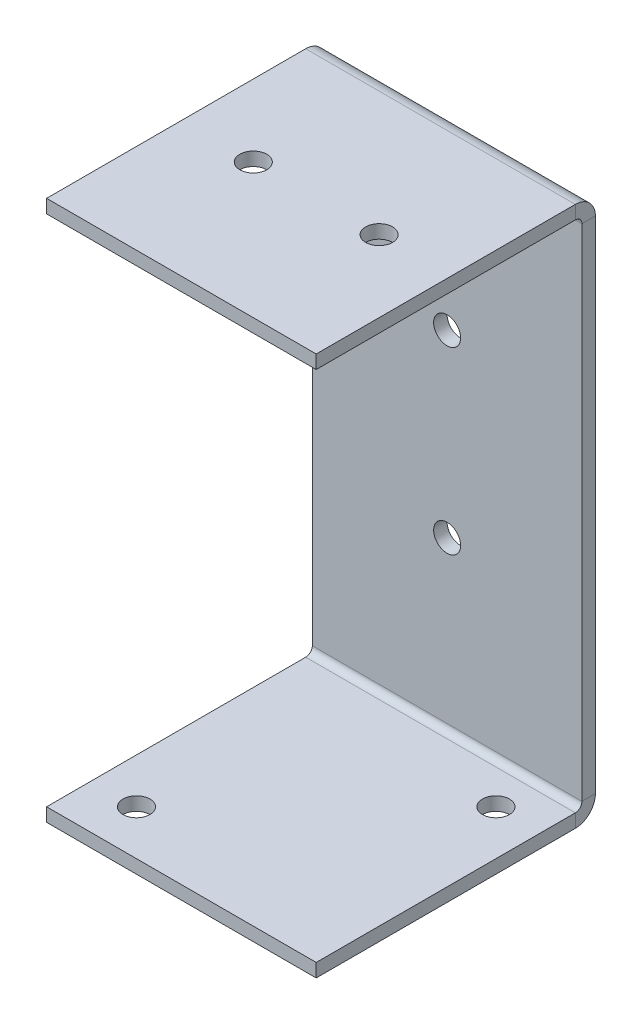
ISO-10303-21;
HEADER;
FILE_DESCRIPTION(('STEP AP214'),'2;1');
FILE_NAME('part.step','',(''),(''),'','','');
FILE_SCHEMA(('AUTOMOTIVE_DESIGN { 1 0 10303 214 1 1 1 1 }'));
ENDSEC;
DATA;
#1=APPLICATION_CONTEXT('core data for automotive mechanical design processes');
#2=APPLICATION_PROTOCOL_DEFINITION('international standard','automotive_design',2000,#1);
#3=PRODUCT_CONTEXT('',#1,'mechanical');
#4=PRODUCT('Part','Part','',(#3));
#5=PRODUCT_RELATED_PRODUCT_CATEGORY('part','',(#4));
#6=PRODUCT_DEFINITION_FORMATION('','',#4);
#7=PRODUCT_DEFINITION_CONTEXT('part definition',#1,'design');
#8=PRODUCT_DEFINITION('design','',#6,#7);
#9=PRODUCT_DEFINITION_SHAPE('','',#8);
#10=(LENGTH_UNIT() NAMED_UNIT(*) SI_UNIT(.MILLI.,.METRE.));
#11=(NAMED_UNIT(*) PLANE_ANGLE_UNIT() SI_UNIT($,.RADIAN.));
#12=(NAMED_UNIT(*) SI_UNIT($,.STERADIAN.) SOLID_ANGLE_UNIT());
#13=UNCERTAINTY_MEASURE_WITH_UNIT(LENGTH_MEASURE(1.E-05),#10,'distance_accuracy_value','');
#14=(GEOMETRIC_REPRESENTATION_CONTEXT(3) GLOBAL_UNCERTAINTY_ASSIGNED_CONTEXT((#13)) GLOBAL_UNIT_ASSIGNED_CONTEXT((#10,
#11,#12)) REPRESENTATION_CONTEXT('',''));
#15=CARTESIAN_POINT('',(0.,0.,0.));
#16=DIRECTION('',(0.,0.,1.));
#17=DIRECTION('',(1.,0.,0.));
#18=AXIS2_PLACEMENT_3D('',#15,#16,#17);
#19=CARTESIAN_POINT('',(0.,-30.4309729097066,-29.5690270902934));
#20=DIRECTION('',(0.,0.,-1.));
#21=DIRECTION('',(0.,1.,0.));
#22=AXIS2_PLACEMENT_3D('',#19,#20,#21);
#23=PLANE('',#22);
#24=CARTESIAN_POINT('',(15.,38.6380541805867,-29.5690270902932));
#25=DIRECTION('',(0.,0.,-1.));
#26=DIRECTION('',(0.,1.,0.));
#27=AXIS2_PLACEMENT_3D('',#24,#25,#26);
#28=CIRCLE('',#27,1.49999999999999);
#29=CARTESIAN_POINT('',(15.,40.1380541805867,-29.5690270902932));
#30=VERTEX_POINT('',#29);
#31=EDGE_CURVE('E655',#30,#30,#28,.T.);
#32=ORIENTED_EDGE('',*,*,#31,.T.);
#33=EDGE_LOOP('',(#32));
#34=FACE_BOUND('',#33,.T.);
#35=CARTESIAN_POINT('',(15.,18.6380541805867,-29.5690270902933));
#36=DIRECTION('',(0.,0.,-1.));
#37=DIRECTION('',(0.,1.,0.));
#38=AXIS2_PLACEMENT_3D('',#35,#36,#37);
#39=CIRCLE('',#38,1.49999999999999);
#40=CARTESIAN_POINT('',(15.,20.1380541805867,-29.5690270902933));
#41=VERTEX_POINT('',#40);
#42=EDGE_CURVE('E317',#41,#41,#39,.T.);
#43=ORIENTED_EDGE('',*,*,#42,.T.);
#44=EDGE_LOOP('',(#43));
#45=FACE_BOUND('',#44,.T.);
#46=DIRECTION('',(0.,-1.,0.));
#47=VECTOR('',#46,1.);
#48=CARTESIAN_POINT('',(0.,-30.4309729097066,-29.5690270902934));
#49=LINE('',#48,#47);
#50=CARTESIAN_POINT('',(0.,56.4014541805867,-29.5690270902932));
#51=VERTEX_POINT('',#50);
#52=CARTESIAN_POINT('',(0.,0.7366,-29.5690270902933));
#53=VERTEX_POINT('',#52);
#54=EDGE_CURVE('E74',#51,#53,#49,.T.);
#55=ORIENTED_EDGE('',*,*,#54,.T.);
#56=DIRECTION('',(1.,0.,0.));
#57=VECTOR('',#56,1.);
#58=CARTESIAN_POINT('',(0.,0.736600000000007,-29.5690270902933));
#59=LINE('',#58,#57);
#60=CARTESIAN_POINT('',(30.,0.7366,-29.5690270902933));
#61=VERTEX_POINT('',#60);
#62=EDGE_CURVE('E66',#53,#61,#59,.T.);
#63=ORIENTED_EDGE('',*,*,#62,.T.);
#64=DIRECTION('',(0.,1.,0.));
#65=VECTOR('',#64,1.);
#66=CARTESIAN_POINT('',(30.,-30.4309729097066,-29.5690270902934));
#67=LINE('',#66,#65);
#68=CARTESIAN_POINT('',(30.,56.4014541805867,-29.5690270902932));
#69=VERTEX_POINT('',#68);
#70=EDGE_CURVE('E82',#61,#69,#67,.T.);
#71=ORIENTED_EDGE('',*,*,#70,.T.);
#72=DIRECTION('',(1.,0.,0.));
#73=VECTOR('',#72,1.);
#74=CARTESIAN_POINT('',(0.,56.4014541805867,-29.5690270902932));
#75=LINE('',#74,#73);
#76=EDGE_CURVE('E267',#51,#69,#75,.T.);
#77=ORIENTED_EDGE('',*,*,#76,.F.);
#78=EDGE_LOOP('',(#55,#63,#71,#77));
#79=FACE_BOUND('',#78,.T.);
#80=ADVANCED_FACE('F57',(#34,#45,#79),#23,.F.);
#81=CARTESIAN_POINT('',(0.,-30.4309729097066,-31.0690270902935));
#82=DIRECTION('',(-1.,0.,0.));
#83=DIRECTION('',(0.,-1.,0.));
#84=AXIS2_PLACEMENT_3D('',#81,#82,#83);
#85=PLANE('',#84);
#86=DIRECTION('',(0.,0.,-1.));
#87=VECTOR('',#86,1.);
#88=CARTESIAN_POINT('',(0.,0.736600000000014,-31.0690270902933));
#89=LINE('',#88,#87);
#90=CARTESIAN_POINT('',(0.,0.736600000000007,-31.0690270902933));
#91=VERTEX_POINT('',#90);
#92=EDGE_CURVE('E14',#53,#91,#89,.T.);
#93=ORIENTED_EDGE('',*,*,#92,.F.);
#94=ORIENTED_EDGE('',*,*,#54,.F.);
#95=DIRECTION('',(0.,0.,-1.));
#96=VECTOR('',#95,1.);
#97=CARTESIAN_POINT('',(0.,56.4014541805867,-31.0690270902932));
#98=LINE('',#97,#96);
#99=CARTESIAN_POINT('',(0.,56.4014541805867,-31.0690270902931));
#100=VERTEX_POINT('',#99);
#101=EDGE_CURVE('E264',#51,#100,#98,.T.);
#102=ORIENTED_EDGE('',*,*,#101,.T.);
#103=DIRECTION('',(0.,-1.,0.));
#104=VECTOR('',#103,1.);
#105=CARTESIAN_POINT('',(0.,-30.4309729097066,-31.0690270902935));
#106=LINE('',#105,#104);
#107=EDGE_CURVE('E276',#100,#91,#106,.T.);
#108=ORIENTED_EDGE('',*,*,#107,.T.);
#109=EDGE_LOOP('',(#93,#94,#102,#108));
#110=FACE_BOUND('',#109,.T.);
#111=ADVANCED_FACE('F59',(#110),#85,.T.);
#112=CARTESIAN_POINT('',(30.,-30.4309729097066,-31.0690270902935));
#113=DIRECTION('',(1.,0.,0.));
#114=DIRECTION('',(0.,1.,0.));
#115=AXIS2_PLACEMENT_3D('',#112,#113,#114);
#116=PLANE('',#115);
#117=DIRECTION('',(0.,0.,1.));
#118=VECTOR('',#117,1.);
#119=CARTESIAN_POINT('',(30.,0.736600000000014,-31.0690270902933));
#120=LINE('',#119,#118);
#121=CARTESIAN_POINT('',(30.,0.736600000000007,-31.0690270902933));
#122=VERTEX_POINT('',#121);
#123=EDGE_CURVE('E273',#122,#61,#120,.T.);
#124=ORIENTED_EDGE('',*,*,#123,.F.);
#125=DIRECTION('',(0.,1.,0.));
#126=VECTOR('',#125,1.);
#127=CARTESIAN_POINT('',(30.,-30.4309729097066,-31.0690270902935));
#128=LINE('',#127,#126);
#129=CARTESIAN_POINT('',(30.,56.4014541805867,-31.0690270902931));
#130=VERTEX_POINT('',#129);
#131=EDGE_CURVE('E61',#122,#130,#128,.T.);
#132=ORIENTED_EDGE('',*,*,#131,.T.);
#133=DIRECTION('',(0.,0.,1.));
#134=VECTOR('',#133,1.);
#135=CARTESIAN_POINT('',(30.,56.4014541805867,-31.0690270902932));
#136=LINE('',#135,#134);
#137=EDGE_CURVE('E270',#130,#69,#136,.T.);
#138=ORIENTED_EDGE('',*,*,#137,.T.);
#139=ORIENTED_EDGE('',*,*,#70,.F.);
#140=EDGE_LOOP('',(#124,#132,#138,#139));
#141=FACE_BOUND('',#140,.T.);
#142=ADVANCED_FACE('F281',(#141),#116,.T.);
#143=CARTESIAN_POINT('',(0.,-30.4309729097066,-31.0690270902935));
#144=DIRECTION('',(0.,0.,-1.));
#145=DIRECTION('',(0.,1.,0.));
#146=AXIS2_PLACEMENT_3D('',#143,#144,#145);
#147=PLANE('',#146);
#148=CARTESIAN_POINT('',(15.,38.6380541805867,-31.0690270902932));
#149=DIRECTION('',(0.,0.,-1.));
#150=DIRECTION('',(0.,1.,0.));
#151=AXIS2_PLACEMENT_3D('',#148,#149,#150);
#152=CIRCLE('',#151,1.49999999999999);
#153=CARTESIAN_POINT('',(15.,40.1380541805867,-31.0690270902932));
#154=VERTEX_POINT('',#153);
#155=EDGE_CURVE('E653',#154,#154,#152,.T.);
#156=ORIENTED_EDGE('',*,*,#155,.F.);
#157=EDGE_LOOP('',(#156));
#158=FACE_BOUND('',#157,.T.);
#159=CARTESIAN_POINT('',(15.,18.6380541805867,-31.0690270902933));
#160=DIRECTION('',(0.,0.,-1.));
#161=DIRECTION('',(0.,1.,0.));
#162=AXIS2_PLACEMENT_3D('',#159,#160,#161);
#163=CIRCLE('',#162,1.49999999999999);
#164=CARTESIAN_POINT('',(15.,20.1380541805867,-31.0690270902933));
#165=VERTEX_POINT('',#164);
#166=EDGE_CURVE('E321',#165,#165,#163,.T.);
#167=ORIENTED_EDGE('',*,*,#166,.F.);
#168=EDGE_LOOP('',(#167));
#169=FACE_BOUND('',#168,.T.);
#170=DIRECTION('',(1.,0.,0.));
#171=VECTOR('',#170,1.);
#172=CARTESIAN_POINT('',(0.,0.736600000000014,-31.0690270902933));
#173=LINE('',#172,#171);
#174=EDGE_CURVE('E171',#91,#122,#173,.T.);
#175=ORIENTED_EDGE('',*,*,#174,.F.);
#176=ORIENTED_EDGE('',*,*,#107,.F.);
#177=DIRECTION('',(1.,0.,0.));
#178=VECTOR('',#177,1.);
#179=CARTESIAN_POINT('',(0.,56.4014541805867,-31.0690270902931));
#180=LINE('',#179,#178);
#181=EDGE_CURVE('E261',#100,#130,#180,.T.);
#182=ORIENTED_EDGE('',*,*,#181,.T.);
#183=ORIENTED_EDGE('',*,*,#131,.F.);
#184=EDGE_LOOP('',(#175,#176,#182,#183));
#185=FACE_BOUND('',#184,.T.);
#186=ADVANCED_FACE('F371',(#158,#169,#185),#147,.T.);
#187=CARTESIAN_POINT('',(0.,56.4014541805867,-28.8324270902931));
#188=DIRECTION('',(-1.,0.,0.));
#189=DIRECTION('',(0.,-1.,0.));
#190=AXIS2_PLACEMENT_3D('',#187,#188,#189);
#191=PLANE('',#190);
#192=ORIENTED_EDGE('',*,*,#101,.F.);
#193=CARTESIAN_POINT('',(0.,56.4014541805867,-28.8324270902931));
#194=DIRECTION('',(1.,0.,0.));
#195=DIRECTION('',(0.,1.,0.));
#196=AXIS2_PLACEMENT_3D('',#193,#194,#195);
#197=CIRCLE('',#196,0.7366);
#198=CARTESIAN_POINT('',(0.,57.1380541805867,-28.8324270902931));
#199=VERTEX_POINT('',#198);
#200=EDGE_CURVE('E208',#51,#199,#197,.T.);
#201=ORIENTED_EDGE('',*,*,#200,.T.);
#202=DIRECTION('',(0.,1.,0.));
#203=VECTOR('',#202,1.);
#204=CARTESIAN_POINT('',(0.,58.6380541805867,-28.8324270902931));
#205=LINE('',#204,#203);
#206=CARTESIAN_POINT('',(0.,58.6380541805867,-28.8324270902931));
#207=VERTEX_POINT('',#206);
#208=EDGE_CURVE('E241',#199,#207,#205,.T.);
#209=ORIENTED_EDGE('',*,*,#208,.T.);
#210=CARTESIAN_POINT('',(0.,56.4014541805867,-28.8324270902931));
#211=DIRECTION('',(1.,0.,0.));
#212=DIRECTION('',(0.,-1.,0.));
#213=AXIS2_PLACEMENT_3D('',#210,#211,#212);
#214=CIRCLE('',#213,2.2366);
#215=EDGE_CURVE('E251',#100,#207,#214,.T.);
#216=ORIENTED_EDGE('',*,*,#215,.F.);
#217=EDGE_LOOP('',(#192,#201,#209,#216));
#218=FACE_BOUND('',#217,.T.);
#219=ADVANCED_FACE('F302',(#218),#191,.T.);
#220=CARTESIAN_POINT('',(30.,56.4014541805867,-28.8324270902931));
#221=DIRECTION('',(1.,0.,0.));
#222=DIRECTION('',(0.,1.,0.));
#223=AXIS2_PLACEMENT_3D('',#220,#221,#222);
#224=PLANE('',#223);
#225=CARTESIAN_POINT('',(30.,56.4014541805867,-28.8324270902931));
#226=DIRECTION('',(1.,0.,0.));
#227=DIRECTION('',(0.,1.,0.));
#228=AXIS2_PLACEMENT_3D('',#225,#226,#227);
#229=CIRCLE('',#228,0.7366);
#230=CARTESIAN_POINT('',(30.,57.1380541805867,-28.8324270902931));
#231=VERTEX_POINT('',#230);
#232=EDGE_CURVE('E255',#231,#69,#229,.F.);
#233=ORIENTED_EDGE('',*,*,#232,.T.);
#234=ORIENTED_EDGE('',*,*,#137,.F.);
#235=CARTESIAN_POINT('',(30.,56.4014541805867,-28.8324270902931));
#236=DIRECTION('',(-1.,0.,0.));
#237=DIRECTION('',(0.,1.,0.));
#238=AXIS2_PLACEMENT_3D('',#235,#236,#237);
#239=CIRCLE('',#238,2.2366);
#240=CARTESIAN_POINT('',(30.,58.6380541805867,-28.8324270902931));
#241=VERTEX_POINT('',#240);
#242=EDGE_CURVE('E254',#241,#130,#239,.T.);
#243=ORIENTED_EDGE('',*,*,#242,.F.);
#244=DIRECTION('',(0.,-1.,0.));
#245=VECTOR('',#244,1.);
#246=CARTESIAN_POINT('',(30.,58.6380541805867,-28.8324270902931));
#247=LINE('',#246,#245);
#248=EDGE_CURVE('E244',#241,#231,#247,.T.);
#249=ORIENTED_EDGE('',*,*,#248,.T.);
#250=EDGE_LOOP('',(#233,#234,#243,#249));
#251=FACE_BOUND('',#250,.T.);
#252=ADVANCED_FACE('F285',(#251),#224,.T.);
#253=CARTESIAN_POINT('',(-15.1281082379549,56.4014541805867,-28.8324270902931));
#254=DIRECTION('',(1.,0.,0.));
#255=DIRECTION('',(0.,1.,0.));
#256=AXIS2_PLACEMENT_3D('',#253,#254,#255);
#257=CYLINDRICAL_SURFACE('',#256,2.2366);
#258=DIRECTION('',(1.,0.,0.));
#259=VECTOR('',#258,1.);
#260=CARTESIAN_POINT('',(0.,58.6380541805867,-28.8324270902931));
#261=LINE('',#260,#259);
#262=EDGE_CURVE('E247',#207,#241,#261,.T.);
#263=ORIENTED_EDGE('',*,*,#262,.T.);
#264=ORIENTED_EDGE('',*,*,#242,.T.);
#265=ORIENTED_EDGE('',*,*,#181,.F.);
#266=ORIENTED_EDGE('',*,*,#215,.T.);
#267=EDGE_LOOP('',(#263,#264,#265,#266));
#268=FACE_BOUND('',#267,.T.);
#269=ADVANCED_FACE('F288',(#268),#257,.T.);
#270=CARTESIAN_POINT('',(-15.1281082379549,56.4014541805867,-28.8324270902931));
#271=DIRECTION('',(1.,0.,0.));
#272=DIRECTION('',(0.,1.,0.));
#273=AXIS2_PLACEMENT_3D('',#270,#271,#272);
#274=CYLINDRICAL_SURFACE('',#273,0.7366);
#275=DIRECTION('',(1.,0.,0.));
#276=VECTOR('',#275,1.);
#277=CARTESIAN_POINT('',(0.,57.1380541805867,-28.8324270902931));
#278=LINE('',#277,#276);
#279=EDGE_CURVE('E216',#199,#231,#278,.T.);
#280=ORIENTED_EDGE('',*,*,#279,.F.);
#281=ORIENTED_EDGE('',*,*,#200,.F.);
#282=ORIENTED_EDGE('',*,*,#76,.T.);
#283=ORIENTED_EDGE('',*,*,#232,.F.);
#284=EDGE_LOOP('',(#280,#281,#282,#283));
#285=FACE_BOUND('',#284,.T.);
#286=ADVANCED_FACE('F306',(#285),#274,.F.);
#287=CARTESIAN_POINT('',(8.,58.6380541805866,-14.9999999999998));
#288=DIRECTION('',(0.,-1.,0.));
#289=DIRECTION('',(0.,0.,-1.));
#290=AXIS2_PLACEMENT_3D('',#287,#288,#289);
#291=CYLINDRICAL_SURFACE('',#290,1.5);
#292=CARTESIAN_POINT('',(8.,58.6380541805866,-14.9999999999998));
#293=DIRECTION('',(0.,-1.,0.));
#294=DIRECTION('',(0.,0.,-1.));
#295=AXIS2_PLACEMENT_3D('',#292,#293,#294);
#296=CIRCLE('',#295,1.5);
#297=CARTESIAN_POINT('',(8.,58.6380541805866,-16.4999999999998));
#298=VERTEX_POINT('',#297);
#299=EDGE_CURVE('E224',#298,#298,#296,.T.);
#300=ORIENTED_EDGE('',*,*,#299,.F.);
#301=EDGE_LOOP('',(#300));
#302=FACE_BOUND('',#301,.T.);
#303=CARTESIAN_POINT('',(8.,57.1380541805866,-14.9999999999998));
#304=DIRECTION('',(0.,-1.,0.));
#305=DIRECTION('',(0.,0.,-1.));
#306=AXIS2_PLACEMENT_3D('',#303,#304,#305);
#307=CIRCLE('',#306,1.5);
#308=CARTESIAN_POINT('',(8.,57.1380541805866,-16.4999999999998));
#309=VERTEX_POINT('',#308);
#310=EDGE_CURVE('E238',#309,#309,#307,.T.);
#311=ORIENTED_EDGE('',*,*,#310,.T.);
#312=EDGE_LOOP('',(#311));
#313=FACE_BOUND('',#312,.T.);
#314=ADVANCED_FACE('F380',(#302,#313),#291,.F.);
#315=CARTESIAN_POINT('',(22.,58.6380541805866,-14.9999999999998));
#316=DIRECTION('',(0.,-1.,0.));
#317=DIRECTION('',(0.,0.,-1.));
#318=AXIS2_PLACEMENT_3D('',#315,#316,#317);
#319=CYLINDRICAL_SURFACE('',#318,1.5);
#320=CARTESIAN_POINT('',(22.,58.6380541805866,-14.9999999999998));
#321=DIRECTION('',(0.,-1.,0.));
#322=DIRECTION('',(0.,0.,-1.));
#323=AXIS2_PLACEMENT_3D('',#320,#321,#322);
#324=CIRCLE('',#323,1.5);
#325=CARTESIAN_POINT('',(22.,58.6380541805866,-16.4999999999998));
#326=VERTEX_POINT('',#325);
#327=EDGE_CURVE('E227',#326,#326,#324,.T.);
#328=ORIENTED_EDGE('',*,*,#327,.F.);
#329=EDGE_LOOP('',(#328));
#330=FACE_BOUND('',#329,.T.);
#331=CARTESIAN_POINT('',(22.,57.1380541805866,-14.9999999999998));
#332=DIRECTION('',(0.,-1.,0.));
#333=DIRECTION('',(0.,0.,-1.));
#334=AXIS2_PLACEMENT_3D('',#331,#332,#333);
#335=CIRCLE('',#334,1.5);
#336=CARTESIAN_POINT('',(22.,57.1380541805866,-16.4999999999998));
#337=VERTEX_POINT('',#336);
#338=EDGE_CURVE('E235',#337,#337,#335,.T.);
#339=ORIENTED_EDGE('',*,*,#338,.T.);
#340=EDGE_LOOP('',(#339));
#341=FACE_BOUND('',#340,.T.);
#342=ADVANCED_FACE('F393',(#330,#341),#319,.F.);
#343=CARTESIAN_POINT('',(0.,58.6380541805865,2.42861286636753E-13));
#344=DIRECTION('',(0.,0.,1.));
#345=DIRECTION('',(-1.,0.,0.));
#346=AXIS2_PLACEMENT_3D('',#343,#344,#345);
#347=PLANE('',#346);
#348=DIRECTION('',(-1.,0.,0.));
#349=VECTOR('',#348,1.);
#350=CARTESIAN_POINT('',(0.,57.1380541805865,2.35922392732846E-13));
#351=LINE('',#350,#349);
#352=CARTESIAN_POINT('',(30.,57.1380541805865,2.35922392732846E-13));
#353=VERTEX_POINT('',#352);
#354=CARTESIAN_POINT('',(0.,57.1380541805865,2.35922392732846E-13));
#355=VERTEX_POINT('',#354);
#356=EDGE_CURVE('E211',#353,#355,#351,.T.);
#357=ORIENTED_EDGE('',*,*,#356,.F.);
#358=DIRECTION('',(0.,-1.,0.));
#359=VECTOR('',#358,1.);
#360=CARTESIAN_POINT('',(30.,58.6380541805865,2.42861286636753E-13));
#361=LINE('',#360,#359);
#362=CARTESIAN_POINT('',(30.,58.6380541805865,2.42861286636753E-13));
#363=VERTEX_POINT('',#362);
#364=EDGE_CURVE('E205',#363,#353,#361,.T.);
#365=ORIENTED_EDGE('',*,*,#364,.F.);
#366=DIRECTION('',(-1.,0.,0.));
#367=VECTOR('',#366,1.);
#368=CARTESIAN_POINT('',(0.,58.6380541805865,2.42861286636753E-13));
#369=LINE('',#368,#367);
#370=CARTESIAN_POINT('',(0.,58.6380541805865,2.42861286636753E-13));
#371=VERTEX_POINT('',#370);
#372=EDGE_CURVE('E232',#363,#371,#369,.T.);
#373=ORIENTED_EDGE('',*,*,#372,.T.);
#374=DIRECTION('',(0.,-1.,0.));
#375=VECTOR('',#374,1.);
#376=CARTESIAN_POINT('',(0.,58.6380541805865,2.42861286636753E-13));
#377=LINE('',#376,#375);
#378=EDGE_CURVE('E230',#371,#355,#377,.T.);
#379=ORIENTED_EDGE('',*,*,#378,.T.);
#380=EDGE_LOOP('',(#357,#365,#373,#379));
#381=FACE_BOUND('',#380,.T.);
#382=ADVANCED_FACE('F390',(#381),#347,.T.);
#383=CARTESIAN_POINT('',(0.,58.6380541805873,-118.));
#384=DIRECTION('',(0.,1.,0.));
#385=DIRECTION('',(0.,0.,1.));
#386=AXIS2_PLACEMENT_3D('',#383,#384,#385);
#387=PLANE('',#386);
#388=ORIENTED_EDGE('',*,*,#262,.F.);
#389=DIRECTION('',(0.,0.,-1.));
#390=VECTOR('',#389,1.);
#391=CARTESIAN_POINT('',(0.,58.6380541805873,-118.));
#392=LINE('',#391,#390);
#393=EDGE_CURVE('E221',#371,#207,#392,.T.);
#394=ORIENTED_EDGE('',*,*,#393,.F.);
#395=ORIENTED_EDGE('',*,*,#372,.F.);
#396=DIRECTION('',(0.,0.,1.));
#397=VECTOR('',#396,1.);
#398=CARTESIAN_POINT('',(30.,58.6380541805873,-118.));
#399=LINE('',#398,#397);
#400=EDGE_CURVE('E209',#241,#363,#399,.T.);
#401=ORIENTED_EDGE('',*,*,#400,.F.);
#402=EDGE_LOOP('',(#388,#394,#395,#401));
#403=FACE_BOUND('',#402,.T.);
#404=ORIENTED_EDGE('',*,*,#327,.T.);
#405=EDGE_LOOP('',(#404));
#406=FACE_BOUND('',#405,.T.);
#407=ORIENTED_EDGE('',*,*,#299,.T.);
#408=EDGE_LOOP('',(#407));
#409=FACE_BOUND('',#408,.T.);
#410=ADVANCED_FACE('F293',(#403,#406,#409),#387,.T.);
#411=CARTESIAN_POINT('',(0.,58.6380541805873,-118.));
#412=DIRECTION('',(-1.,0.,0.));
#413=DIRECTION('',(0.,0.,-1.));
#414=AXIS2_PLACEMENT_3D('',#411,#412,#413);
#415=PLANE('',#414);
#416=ORIENTED_EDGE('',*,*,#208,.F.);
#417=DIRECTION('',(0.,0.,-1.));
#418=VECTOR('',#417,1.);
#419=CARTESIAN_POINT('',(0.,57.1380541805873,-118.));
#420=LINE('',#419,#418);
#421=EDGE_CURVE('E219',#355,#199,#420,.T.);
#422=ORIENTED_EDGE('',*,*,#421,.F.);
#423=ORIENTED_EDGE('',*,*,#378,.F.);
#424=ORIENTED_EDGE('',*,*,#393,.T.);
#425=EDGE_LOOP('',(#416,#422,#423,#424));
#426=FACE_BOUND('',#425,.T.);
#427=ADVANCED_FACE('F298',(#426),#415,.T.);
#428=CARTESIAN_POINT('',(0.,57.1380541805873,-118.));
#429=DIRECTION('',(0.,1.,0.));
#430=DIRECTION('',(0.,0.,1.));
#431=AXIS2_PLACEMENT_3D('',#428,#429,#430);
#432=PLANE('',#431);
#433=ORIENTED_EDGE('',*,*,#310,.F.);
#434=EDGE_LOOP('',(#433));
#435=FACE_BOUND('',#434,.T.);
#436=ORIENTED_EDGE('',*,*,#338,.F.);
#437=EDGE_LOOP('',(#436));
#438=FACE_BOUND('',#437,.T.);
#439=ORIENTED_EDGE('',*,*,#421,.T.);
#440=ORIENTED_EDGE('',*,*,#279,.T.);
#441=DIRECTION('',(0.,0.,1.));
#442=VECTOR('',#441,1.);
#443=CARTESIAN_POINT('',(30.,57.1380541805873,-118.));
#444=LINE('',#443,#442);
#445=EDGE_CURVE('E214',#231,#353,#444,.T.);
#446=ORIENTED_EDGE('',*,*,#445,.T.);
#447=ORIENTED_EDGE('',*,*,#356,.T.);
#448=EDGE_LOOP('',(#439,#440,#446,#447));
#449=FACE_BOUND('',#448,.T.);
#450=ADVANCED_FACE('F355',(#435,#438,#449),#432,.F.);
#451=CARTESIAN_POINT('',(30.,58.6380541805873,-118.));
#452=DIRECTION('',(1.,0.,0.));
#453=DIRECTION('',(0.,0.,1.));
#454=AXIS2_PLACEMENT_3D('',#451,#452,#453);
#455=PLANE('',#454);
#456=ORIENTED_EDGE('',*,*,#248,.F.);
#457=ORIENTED_EDGE('',*,*,#400,.T.);
#458=ORIENTED_EDGE('',*,*,#364,.T.);
#459=ORIENTED_EDGE('',*,*,#445,.F.);
#460=EDGE_LOOP('',(#456,#457,#458,#459));
#461=FACE_BOUND('',#460,.T.);
#462=ADVANCED_FACE('F346',(#461),#455,.T.);
#463=CARTESIAN_POINT('',(0.,-1.5,0.));
#464=DIRECTION('',(0.,0.,1.));
#465=DIRECTION('',(1.,0.,0.));
#466=AXIS2_PLACEMENT_3D('',#463,#464,#465);
#467=PLANE('',#466);
#468=DIRECTION('',(1.,0.,0.));
#469=VECTOR('',#468,1.);
#470=CARTESIAN_POINT('',(0.,0.,0.));
#471=LINE('',#470,#469);
#472=CARTESIAN_POINT('',(0.,0.,0.));
#473=VERTEX_POINT('',#472);
#474=CARTESIAN_POINT('',(30.,0.,0.));
#475=VERTEX_POINT('',#474);
#476=EDGE_CURVE('E332',#473,#475,#471,.T.);
#477=ORIENTED_EDGE('',*,*,#476,.F.);
#478=DIRECTION('',(0.,1.,0.));
#479=VECTOR('',#478,1.);
#480=CARTESIAN_POINT('',(0.,-1.5,0.));
#481=LINE('',#480,#479);
#482=CARTESIAN_POINT('',(0.,-1.5,0.));
#483=VERTEX_POINT('',#482);
#484=EDGE_CURVE('E250',#483,#473,#481,.T.);
#485=ORIENTED_EDGE('',*,*,#484,.F.);
#486=DIRECTION('',(1.,0.,0.));
#487=VECTOR('',#486,1.);
#488=CARTESIAN_POINT('',(0.,-1.5,0.));
#489=LINE('',#488,#487);
#490=CARTESIAN_POINT('',(30.,-1.5,0.));
#491=VERTEX_POINT('',#490);
#492=EDGE_CURVE('E202',#483,#491,#489,.T.);
#493=ORIENTED_EDGE('',*,*,#492,.T.);
#494=DIRECTION('',(0.,1.,0.));
#495=VECTOR('',#494,1.);
#496=CARTESIAN_POINT('',(30.,-1.5,0.));
#497=LINE('',#496,#495);
#498=EDGE_CURVE('E186',#491,#475,#497,.T.);
#499=ORIENTED_EDGE('',*,*,#498,.T.);
#500=EDGE_LOOP('',(#477,#485,#493,#499));
#501=FACE_BOUND('',#500,.T.);
#502=ADVANCED_FACE('F343',(#501),#467,.T.);
#503=CARTESIAN_POINT('',(5.,-1.5,-5.));
#504=DIRECTION('',(0.,1.,0.));
#505=DIRECTION('',(0.,0.,1.));
#506=AXIS2_PLACEMENT_3D('',#503,#504,#505);
#507=CYLINDRICAL_SURFACE('',#506,1.5);
#508=CARTESIAN_POINT('',(5.,-1.5,-5.));
#509=DIRECTION('',(0.,1.,0.));
#510=DIRECTION('',(0.,0.,1.));
#511=AXIS2_PLACEMENT_3D('',#508,#509,#510);
#512=CIRCLE('',#511,1.5);
#513=CARTESIAN_POINT('',(5.,-1.5,-3.5));
#514=VERTEX_POINT('',#513);
#515=EDGE_CURVE('E183',#514,#514,#512,.T.);
#516=ORIENTED_EDGE('',*,*,#515,.F.);
#517=EDGE_LOOP('',(#516));
#518=FACE_BOUND('',#517,.T.);
#519=CARTESIAN_POINT('',(5.,0.,-5.));
#520=DIRECTION('',(0.,1.,0.));
#521=DIRECTION('',(0.,0.,1.));
#522=AXIS2_PLACEMENT_3D('',#519,#520,#521);
#523=CIRCLE('',#522,1.5);
#524=CARTESIAN_POINT('',(5.,0.,-3.5));
#525=VERTEX_POINT('',#524);
#526=EDGE_CURVE('E198',#525,#525,#523,.T.);
#527=ORIENTED_EDGE('',*,*,#526,.T.);
#528=EDGE_LOOP('',(#527));
#529=FACE_BOUND('',#528,.T.);
#530=ADVANCED_FACE('F345',(#518,#529),#507,.F.);
#531=CARTESIAN_POINT('',(25.,-1.5,-25.));
#532=DIRECTION('',(0.,1.,0.));
#533=DIRECTION('',(0.,0.,1.));
#534=AXIS2_PLACEMENT_3D('',#531,#532,#533);
#535=CYLINDRICAL_SURFACE('',#534,1.5);
#536=CARTESIAN_POINT('',(25.,-1.5,-25.));
#537=DIRECTION('',(0.,1.,0.));
#538=DIRECTION('',(0.,0.,1.));
#539=AXIS2_PLACEMENT_3D('',#536,#537,#538);
#540=CIRCLE('',#539,1.5);
#541=CARTESIAN_POINT('',(25.,-1.5,-23.5));
#542=VERTEX_POINT('',#541);
#543=EDGE_CURVE('E192',#542,#542,#540,.T.);
#544=ORIENTED_EDGE('',*,*,#543,.F.);
#545=EDGE_LOOP('',(#544));
#546=FACE_BOUND('',#545,.T.);
#547=CARTESIAN_POINT('',(25.,0.,-25.));
#548=DIRECTION('',(0.,1.,0.));
#549=DIRECTION('',(0.,0.,1.));
#550=AXIS2_PLACEMENT_3D('',#547,#548,#549);
#551=CIRCLE('',#550,1.5);
#552=CARTESIAN_POINT('',(25.,0.,-23.5));
#553=VERTEX_POINT('',#552);
#554=EDGE_CURVE('E195',#553,#553,#551,.T.);
#555=ORIENTED_EDGE('',*,*,#554,.T.);
#556=EDGE_LOOP('',(#555));
#557=FACE_BOUND('',#556,.T.);
#558=ADVANCED_FACE('F352',(#546,#557),#535,.F.);
#559=CARTESIAN_POINT('',(0.,-1.5,0.));
#560=DIRECTION('',(0.,-1.,0.));
#561=DIRECTION('',(0.,0.,-1.));
#562=AXIS2_PLACEMENT_3D('',#559,#560,#561);
#563=PLANE('',#562);
#564=ORIENTED_EDGE('',*,*,#543,.T.);
#565=EDGE_LOOP('',(#564));
#566=FACE_BOUND('',#565,.T.);
#567=ORIENTED_EDGE('',*,*,#515,.T.);
#568=EDGE_LOOP('',(#567));
#569=FACE_BOUND('',#568,.T.);
#570=DIRECTION('',(0.,0.,1.));
#571=VECTOR('',#570,1.);
#572=CARTESIAN_POINT('',(0.,-1.5,0.));
#573=LINE('',#572,#571);
#574=CARTESIAN_POINT('',(0.,-1.5,-28.8324270902933));
#575=VERTEX_POINT('',#574);
#576=EDGE_CURVE('E181',#575,#483,#573,.T.);
#577=ORIENTED_EDGE('',*,*,#576,.F.);
#578=DIRECTION('',(1.,0.,0.));
#579=VECTOR('',#578,1.);
#580=CARTESIAN_POINT('',(0.,-1.5,-28.8324270902934));
#581=LINE('',#580,#579);
#582=CARTESIAN_POINT('',(30.,-1.5,-28.8324270902933));
#583=VERTEX_POINT('',#582);
#584=EDGE_CURVE('E169',#575,#583,#581,.T.);
#585=ORIENTED_EDGE('',*,*,#584,.T.);
#586=DIRECTION('',(0.,0.,-1.));
#587=VECTOR('',#586,1.);
#588=CARTESIAN_POINT('',(30.,-1.5,0.));
#589=LINE('',#588,#587);
#590=EDGE_CURVE('E162',#491,#583,#589,.T.);
#591=ORIENTED_EDGE('',*,*,#590,.F.);
#592=ORIENTED_EDGE('',*,*,#492,.F.);
#593=EDGE_LOOP('',(#577,#585,#591,#592));
#594=FACE_BOUND('',#593,.T.);
#595=ADVANCED_FACE('F178',(#566,#569,#594),#563,.T.);
#596=CARTESIAN_POINT('',(30.,-1.5,0.));
#597=DIRECTION('',(1.,0.,0.));
#598=DIRECTION('',(0.,0.,-1.));
#599=AXIS2_PLACEMENT_3D('',#596,#597,#598);
#600=PLANE('',#599);
#601=ORIENTED_EDGE('',*,*,#590,.T.);
#602=DIRECTION('',(0.,1.,0.));
#603=VECTOR('',#602,1.);
#604=CARTESIAN_POINT('',(30.,-1.5,-28.8324270902934));
#605=LINE('',#604,#603);
#606=CARTESIAN_POINT('',(30.,0.,-28.8324270902933));
#607=VERTEX_POINT('',#606);
#608=EDGE_CURVE('E150',#583,#607,#605,.T.);
#609=ORIENTED_EDGE('',*,*,#608,.T.);
#610=DIRECTION('',(0.,0.,-1.));
#611=VECTOR('',#610,1.);
#612=CARTESIAN_POINT('',(30.,0.,0.));
#613=LINE('',#612,#611);
#614=EDGE_CURVE('E329',#475,#607,#613,.T.);
#615=ORIENTED_EDGE('',*,*,#614,.F.);
#616=ORIENTED_EDGE('',*,*,#498,.F.);
#617=EDGE_LOOP('',(#601,#609,#615,#616));
#618=FACE_BOUND('',#617,.T.);
#619=ADVANCED_FACE('F185',(#618),#600,.T.);
#620=CARTESIAN_POINT('',(0.,0.,0.));
#621=DIRECTION('',(0.,-1.,0.));
#622=DIRECTION('',(0.,0.,-1.));
#623=AXIS2_PLACEMENT_3D('',#620,#621,#622);
#624=PLANE('',#623);
#625=DIRECTION('',(1.,0.,0.));
#626=VECTOR('',#625,1.);
#627=CARTESIAN_POINT('',(0.,0.,-28.8324270902934));
#628=LINE('',#627,#626);
#629=CARTESIAN_POINT('',(0.,0.,-28.8324270902933));
#630=VERTEX_POINT('',#629);
#631=EDGE_CURVE('E172',#630,#607,#628,.T.);
#632=ORIENTED_EDGE('',*,*,#631,.F.);
#633=DIRECTION('',(0.,0.,1.));
#634=VECTOR('',#633,1.);
#635=CARTESIAN_POINT('',(0.,0.,0.));
#636=LINE('',#635,#634);
#637=EDGE_CURVE('E161',#630,#473,#636,.T.);
#638=ORIENTED_EDGE('',*,*,#637,.T.);
#639=ORIENTED_EDGE('',*,*,#476,.T.);
#640=ORIENTED_EDGE('',*,*,#614,.T.);
#641=EDGE_LOOP('',(#632,#638,#639,#640));
#642=FACE_BOUND('',#641,.T.);
#643=ORIENTED_EDGE('',*,*,#526,.F.);
#644=EDGE_LOOP('',(#643));
#645=FACE_BOUND('',#644,.T.);
#646=ORIENTED_EDGE('',*,*,#554,.F.);
#647=EDGE_LOOP('',(#646));
#648=FACE_BOUND('',#647,.T.);
#649=ADVANCED_FACE('F336',(#642,#645,#648),#624,.F.);
#650=CARTESIAN_POINT('',(0.,-1.5,0.));
#651=DIRECTION('',(-1.,0.,0.));
#652=DIRECTION('',(0.,0.,1.));
#653=AXIS2_PLACEMENT_3D('',#650,#651,#652);
#654=PLANE('',#653);
#655=ORIENTED_EDGE('',*,*,#637,.F.);
#656=DIRECTION('',(0.,-1.,0.));
#657=VECTOR('',#656,1.);
#658=CARTESIAN_POINT('',(0.,-1.5,-28.8324270902934));
#659=LINE('',#658,#657);
#660=EDGE_CURVE('E316',#630,#575,#659,.T.);
#661=ORIENTED_EDGE('',*,*,#660,.T.);
#662=ORIENTED_EDGE('',*,*,#576,.T.);
#663=ORIENTED_EDGE('',*,*,#484,.T.);
#664=EDGE_LOOP('',(#655,#661,#662,#663));
#665=FACE_BOUND('',#664,.T.);
#666=ADVANCED_FACE('F341',(#665),#654,.T.);
#667=CARTESIAN_POINT('',(0.,0.7366,-28.8324270902934));
#668=DIRECTION('',(-1.,0.,0.));
#669=DIRECTION('',(0.,0.,1.));
#670=AXIS2_PLACEMENT_3D('',#667,#668,#669);
#671=PLANE('',#670);
#672=ORIENTED_EDGE('',*,*,#660,.F.);
#673=CARTESIAN_POINT('',(0.,0.7366,-28.8324270902934));
#674=DIRECTION('',(1.,0.,0.));
#675=DIRECTION('',(0.,0.,-1.));
#676=AXIS2_PLACEMENT_3D('',#673,#674,#675);
#677=CIRCLE('',#676,0.7366);
#678=EDGE_CURVE('E313',#630,#53,#677,.T.);
#679=ORIENTED_EDGE('',*,*,#678,.T.);
#680=ORIENTED_EDGE('',*,*,#92,.T.);
#681=CARTESIAN_POINT('',(0.,0.7366,-28.8324270902934));
#682=DIRECTION('',(1.,0.,0.));
#683=DIRECTION('',(0.,0.,1.));
#684=AXIS2_PLACEMENT_3D('',#681,#682,#683);
#685=CIRCLE('',#684,2.2366);
#686=EDGE_CURVE('E173',#575,#91,#685,.T.);
#687=ORIENTED_EDGE('',*,*,#686,.F.);
#688=EDGE_LOOP('',(#672,#679,#680,#687));
#689=FACE_BOUND('',#688,.T.);
#690=ADVANCED_FACE('F315',(#689),#671,.T.);
#691=CARTESIAN_POINT('',(30.,0.7366,-28.8324270902934));
#692=DIRECTION('',(1.,0.,0.));
#693=DIRECTION('',(0.,0.,-1.));
#694=AXIS2_PLACEMENT_3D('',#691,#692,#693);
#695=PLANE('',#694);
#696=CARTESIAN_POINT('',(30.,0.7366,-28.8324270902934));
#697=DIRECTION('',(1.,0.,0.));
#698=DIRECTION('',(0.,0.,-1.));
#699=AXIS2_PLACEMENT_3D('',#696,#697,#698);
#700=CIRCLE('',#699,0.7366);
#701=EDGE_CURVE('E156',#61,#607,#700,.F.);
#702=ORIENTED_EDGE('',*,*,#701,.T.);
#703=ORIENTED_EDGE('',*,*,#608,.F.);
#704=CARTESIAN_POINT('',(30.,0.7366,-28.8324270902934));
#705=DIRECTION('',(-1.,0.,0.));
#706=DIRECTION('',(0.,0.,-1.));
#707=AXIS2_PLACEMENT_3D('',#704,#705,#706);
#708=CIRCLE('',#707,2.2366);
#709=EDGE_CURVE('E154',#122,#583,#708,.T.);
#710=ORIENTED_EDGE('',*,*,#709,.F.);
#711=ORIENTED_EDGE('',*,*,#123,.T.);
#712=EDGE_LOOP('',(#702,#703,#710,#711));
#713=FACE_BOUND('',#712,.T.);
#714=ADVANCED_FACE('F152',(#713),#695,.T.);
#715=CARTESIAN_POINT('',(-15.1281082379549,0.7366,-28.8324270902934));
#716=DIRECTION('',(1.,0.,0.));
#717=DIRECTION('',(0.,0.,-1.));
#718=AXIS2_PLACEMENT_3D('',#715,#716,#717);
#719=CYLINDRICAL_SURFACE('',#718,2.2366);
#720=ORIENTED_EDGE('',*,*,#174,.T.);
#721=ORIENTED_EDGE('',*,*,#709,.T.);
#722=ORIENTED_EDGE('',*,*,#584,.F.);
#723=ORIENTED_EDGE('',*,*,#686,.T.);
#724=EDGE_LOOP('',(#720,#721,#722,#723));
#725=FACE_BOUND('',#724,.T.);
#726=ADVANCED_FACE('F167',(#725),#719,.T.);
#727=CARTESIAN_POINT('',(-15.1281082379549,0.7366,-28.8324270902934));
#728=DIRECTION('',(1.,0.,0.));
#729=DIRECTION('',(0.,0.,-1.));
#730=AXIS2_PLACEMENT_3D('',#727,#728,#729);
#731=CYLINDRICAL_SURFACE('',#730,0.7366);
#732=ORIENTED_EDGE('',*,*,#62,.F.);
#733=ORIENTED_EDGE('',*,*,#678,.F.);
#734=ORIENTED_EDGE('',*,*,#631,.T.);
#735=ORIENTED_EDGE('',*,*,#701,.F.);
#736=EDGE_LOOP('',(#732,#733,#734,#735));
#737=FACE_BOUND('',#736,.T.);
#738=ADVANCED_FACE('F312',(#737),#731,.F.);
#739=CARTESIAN_POINT('',(15.,18.6380541805867,-31.0690270902933));
#740=DIRECTION('',(0.,0.,-1.));
#741=DIRECTION('',(0.,1.,0.));
#742=AXIS2_PLACEMENT_3D('',#739,#740,#741);
#743=CYLINDRICAL_SURFACE('',#742,1.49999999999999);
#744=ORIENTED_EDGE('',*,*,#166,.T.);
#745=EDGE_LOOP('',(#744));
#746=FACE_BOUND('',#745,.T.);
#747=ORIENTED_EDGE('',*,*,#42,.F.);
#748=EDGE_LOOP('',(#747));
#749=FACE_BOUND('',#748,.T.);
#750=ADVANCED_FACE('F462',(#746,#749),#743,.F.);
#751=CARTESIAN_POINT('',(15.,38.6380541805867,-31.0690270902932));
#752=DIRECTION('',(0.,0.,-1.));
#753=DIRECTION('',(0.,1.,0.));
#754=AXIS2_PLACEMENT_3D('',#751,#752,#753);
#755=CYLINDRICAL_SURFACE('',#754,1.49999999999999);
#756=ORIENTED_EDGE('',*,*,#155,.T.);
#757=EDGE_LOOP('',(#756));
#758=FACE_BOUND('',#757,.T.);
#759=ORIENTED_EDGE('',*,*,#31,.F.);
#760=EDGE_LOOP('',(#759));
#761=FACE_BOUND('',#760,.T.);
#762=ADVANCED_FACE('F469',(#758,#761),#755,.F.);
#763=CLOSED_SHELL('',(#80,#111,#142,#186,#219,#252,#269,#286,#314,#342,#382,#410,#427,#450,#462,
#502,#530,#558,#595,#619,#649,#666,#690,#714,#726,#738,#750,#762));
#764=MANIFOLD_SOLID_BREP('B2',#763);
#765=ADVANCED_BREP_SHAPE_REPRESENTATION('',(#18,#764),#14);
#766=SHAPE_DEFINITION_REPRESENTATION(#9,#765);
ENDSEC;
END-ISO-10303-21;
